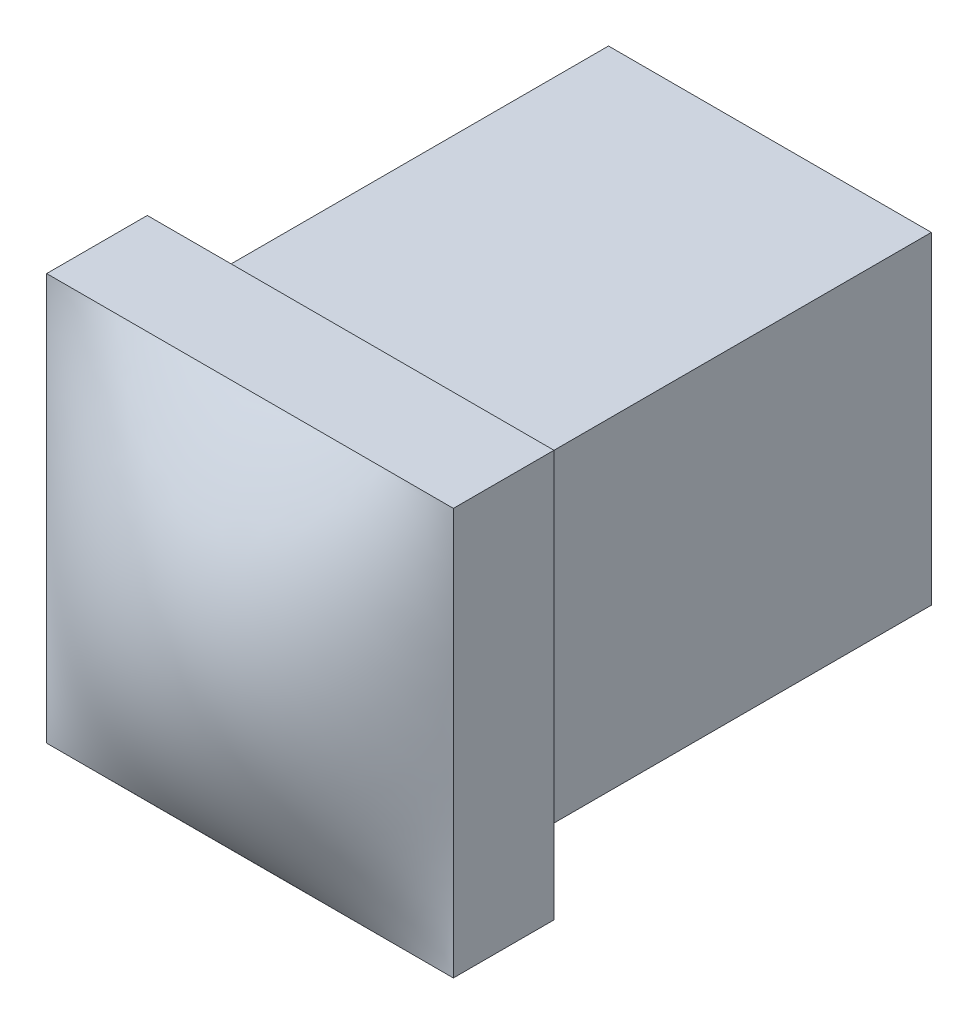
ISO-10303-21;
HEADER;
FILE_DESCRIPTION(('STEP AP214'),'2;1');
FILE_NAME('part.step','',(''),(''),'','','');
FILE_SCHEMA(('AUTOMOTIVE_DESIGN { 1 0 10303 214 1 1 1 1 }'));
ENDSEC;
DATA;
#1=APPLICATION_CONTEXT('core data for automotive mechanical design processes');
#2=APPLICATION_PROTOCOL_DEFINITION('international standard','automotive_design',2000,#1);
#3=PRODUCT_CONTEXT('',#1,'mechanical');
#4=PRODUCT('Part','Part','',(#3));
#5=PRODUCT_RELATED_PRODUCT_CATEGORY('part','',(#4));
#6=PRODUCT_DEFINITION_FORMATION('','',#4);
#7=PRODUCT_DEFINITION_CONTEXT('part definition',#1,'design');
#8=PRODUCT_DEFINITION('design','',#6,#7);
#9=PRODUCT_DEFINITION_SHAPE('','',#8);
#10=(LENGTH_UNIT() NAMED_UNIT(*) SI_UNIT(.MILLI.,.METRE.));
#11=(NAMED_UNIT(*) PLANE_ANGLE_UNIT() SI_UNIT($,.RADIAN.));
#12=(NAMED_UNIT(*) SI_UNIT($,.STERADIAN.) SOLID_ANGLE_UNIT());
#13=UNCERTAINTY_MEASURE_WITH_UNIT(LENGTH_MEASURE(1.E-05),#10,'distance_accuracy_value','');
#14=(GEOMETRIC_REPRESENTATION_CONTEXT(3) GLOBAL_UNCERTAINTY_ASSIGNED_CONTEXT((#13)) GLOBAL_UNIT_ASSIGNED_CONTEXT((#10,
#11,#12)) REPRESENTATION_CONTEXT('',''));
#15=CARTESIAN_POINT('',(0.,0.,0.));
#16=DIRECTION('',(0.,0.,1.));
#17=DIRECTION('',(1.,0.,0.));
#18=AXIS2_PLACEMENT_3D('',#15,#16,#17);
#19=CARTESIAN_POINT('',(0.,0.,0.));
#20=DIRECTION('',(0.,0.,-1.));
#21=DIRECTION('',(-1.,0.,0.));
#22=AXIS2_PLACEMENT_3D('',#19,#20,#21);
#23=PLANE('',#22);
#24=DIRECTION('',(0.,-1.,0.));
#25=VECTOR('',#24,1.);
#26=CARTESIAN_POINT('',(0.,0.,0.));
#27=LINE('',#26,#25);
#28=CARTESIAN_POINT('',(0.,4.85,0.));
#29=VERTEX_POINT('',#28);
#30=CARTESIAN_POINT('',(0.,0.,0.));
#31=VERTEX_POINT('',#30);
#32=EDGE_CURVE('E139',#29,#31,#27,.T.);
#33=ORIENTED_EDGE('',*,*,#32,.F.);
#34=DIRECTION('',(-1.,0.,0.));
#35=VECTOR('',#34,1.);
#36=CARTESIAN_POINT('',(0.,4.85,0.));
#37=LINE('',#36,#35);
#38=CARTESIAN_POINT('',(4.85,4.85,0.));
#39=VERTEX_POINT('',#38);
#40=EDGE_CURVE('E78',#39,#29,#37,.T.);
#41=ORIENTED_EDGE('',*,*,#40,.F.);
#42=DIRECTION('',(0.,1.,0.));
#43=VECTOR('',#42,1.);
#44=CARTESIAN_POINT('',(4.85,0.,0.));
#45=LINE('',#44,#43);
#46=CARTESIAN_POINT('',(4.85,0.,0.));
#47=VERTEX_POINT('',#46);
#48=EDGE_CURVE('E86',#47,#39,#45,.T.);
#49=ORIENTED_EDGE('',*,*,#48,.F.);
#50=DIRECTION('',(1.,0.,0.));
#51=VECTOR('',#50,1.);
#52=CARTESIAN_POINT('',(0.,0.,0.));
#53=LINE('',#52,#51);
#54=EDGE_CURVE('E142',#31,#47,#53,.T.);
#55=ORIENTED_EDGE('',*,*,#54,.F.);
#56=EDGE_LOOP('',(#33,#41,#49,#55));
#57=FACE_BOUND('',#56,.T.);
#58=DIRECTION('',(1.,0.,0.));
#59=VECTOR('',#58,1.);
#60=CARTESIAN_POINT('',(4.35,4.35,0.));
#61=LINE('',#60,#59);
#62=CARTESIAN_POINT('',(0.499999999999999,4.35,0.));
#63=VERTEX_POINT('',#62);
#64=CARTESIAN_POINT('',(4.35,4.35,0.));
#65=VERTEX_POINT('',#64);
#66=EDGE_CURVE('E172',#63,#65,#61,.T.);
#67=ORIENTED_EDGE('',*,*,#66,.F.);
#68=DIRECTION('',(0.,1.,0.));
#69=VECTOR('',#68,1.);
#70=CARTESIAN_POINT('',(0.499999999999999,4.35,0.));
#71=LINE('',#70,#69);
#72=CARTESIAN_POINT('',(0.499999999999998,0.499999999999999,0.));
#73=VERTEX_POINT('',#72);
#74=EDGE_CURVE('E137',#73,#63,#71,.T.);
#75=ORIENTED_EDGE('',*,*,#74,.F.);
#76=DIRECTION('',(-1.,0.,0.));
#77=VECTOR('',#76,1.);
#78=CARTESIAN_POINT('',(4.35,0.499999999999999,0.));
#79=LINE('',#78,#77);
#80=CARTESIAN_POINT('',(4.35,0.499999999999999,0.));
#81=VERTEX_POINT('',#80);
#82=EDGE_CURVE('E133',#81,#73,#79,.T.);
#83=ORIENTED_EDGE('',*,*,#82,.F.);
#84=DIRECTION('',(0.,-1.,0.));
#85=VECTOR('',#84,1.);
#86=CARTESIAN_POINT('',(4.35,4.35,0.));
#87=LINE('',#86,#85);
#88=EDGE_CURVE('E174',#65,#81,#87,.T.);
#89=ORIENTED_EDGE('',*,*,#88,.F.);
#90=EDGE_LOOP('',(#67,#75,#83,#89));
#91=FACE_BOUND('',#90,.T.);
#92=ADVANCED_FACE('F32',(#57,#91),#23,.T.);
#93=CARTESIAN_POINT('',(0.,0.,1.2));
#94=DIRECTION('',(1.,0.,0.));
#95=DIRECTION('',(0.,0.,-1.));
#96=AXIS2_PLACEMENT_3D('',#93,#94,#95);
#97=PLANE('',#96);
#98=ORIENTED_EDGE('',*,*,#32,.T.);
#99=DIRECTION('',(0.,0.,-1.));
#100=VECTOR('',#99,1.);
#101=CARTESIAN_POINT('',(0.,0.,1.2));
#102=LINE('',#101,#100);
#103=CARTESIAN_POINT('',(0.,0.,1.2));
#104=VERTEX_POINT('',#103);
#105=EDGE_CURVE('E11',#104,#31,#102,.T.);
#106=ORIENTED_EDGE('',*,*,#105,.F.);
#107=DIRECTION('',(0.,-1.,0.));
#108=VECTOR('',#107,1.);
#109=CARTESIAN_POINT('',(0.,0.,1.2));
#110=LINE('',#109,#108);
#111=CARTESIAN_POINT('',(0.,4.85,1.2));
#112=VERTEX_POINT('',#111);
#113=EDGE_CURVE('E150',#112,#104,#110,.T.);
#114=ORIENTED_EDGE('',*,*,#113,.F.);
#115=DIRECTION('',(0.,0.,-1.));
#116=VECTOR('',#115,1.);
#117=CARTESIAN_POINT('',(0.,4.85,1.2));
#118=LINE('',#117,#116);
#119=EDGE_CURVE('E151',#112,#29,#118,.T.);
#120=ORIENTED_EDGE('',*,*,#119,.T.);
#121=EDGE_LOOP('',(#98,#106,#114,#120));
#122=FACE_BOUND('',#121,.T.);
#123=ADVANCED_FACE('F166',(#122),#97,.F.);
#124=CARTESIAN_POINT('',(0.,0.,1.2));
#125=DIRECTION('',(0.,1.,0.));
#126=DIRECTION('',(0.,0.,1.));
#127=AXIS2_PLACEMENT_3D('',#124,#125,#126);
#128=PLANE('',#127);
#129=ORIENTED_EDGE('',*,*,#54,.T.);
#130=DIRECTION('',(0.,0.,-1.));
#131=VECTOR('',#130,1.);
#132=CARTESIAN_POINT('',(4.85,0.,1.2));
#133=LINE('',#132,#131);
#134=CARTESIAN_POINT('',(4.85,0.,1.2));
#135=VERTEX_POINT('',#134);
#136=EDGE_CURVE('E43',#135,#47,#133,.T.);
#137=ORIENTED_EDGE('',*,*,#136,.F.);
#138=DIRECTION('',(1.,0.,0.));
#139=VECTOR('',#138,1.);
#140=CARTESIAN_POINT('',(0.,0.,1.2));
#141=LINE('',#140,#139);
#142=EDGE_CURVE('E38',#104,#135,#141,.T.);
#143=ORIENTED_EDGE('',*,*,#142,.F.);
#144=ORIENTED_EDGE('',*,*,#105,.T.);
#145=EDGE_LOOP('',(#129,#137,#143,#144));
#146=FACE_BOUND('',#145,.T.);
#147=ADVANCED_FACE('F161',(#146),#128,.F.);
#148=CARTESIAN_POINT('',(4.85,0.,1.2));
#149=DIRECTION('',(-1.,0.,0.));
#150=DIRECTION('',(0.,0.,1.));
#151=AXIS2_PLACEMENT_3D('',#148,#149,#150);
#152=PLANE('',#151);
#153=ORIENTED_EDGE('',*,*,#48,.T.);
#154=DIRECTION('',(0.,0.,-1.));
#155=VECTOR('',#154,1.);
#156=CARTESIAN_POINT('',(4.85,4.85,1.2));
#157=LINE('',#156,#155);
#158=CARTESIAN_POINT('',(4.85,4.85,1.2));
#159=VERTEX_POINT('',#158);
#160=EDGE_CURVE('E153',#159,#39,#157,.T.);
#161=ORIENTED_EDGE('',*,*,#160,.F.);
#162=DIRECTION('',(0.,1.,0.));
#163=VECTOR('',#162,1.);
#164=CARTESIAN_POINT('',(4.85,0.,1.2));
#165=LINE('',#164,#163);
#166=EDGE_CURVE('E157',#135,#159,#165,.T.);
#167=ORIENTED_EDGE('',*,*,#166,.F.);
#168=ORIENTED_EDGE('',*,*,#136,.T.);
#169=EDGE_LOOP('',(#153,#161,#167,#168));
#170=FACE_BOUND('',#169,.T.);
#171=ADVANCED_FACE('F162',(#170),#152,.F.);
#172=CARTESIAN_POINT('',(0.,4.85,1.2));
#173=DIRECTION('',(0.,-1.,0.));
#174=DIRECTION('',(0.,0.,-1.));
#175=AXIS2_PLACEMENT_3D('',#172,#173,#174);
#176=PLANE('',#175);
#177=ORIENTED_EDGE('',*,*,#40,.T.);
#178=ORIENTED_EDGE('',*,*,#119,.F.);
#179=DIRECTION('',(-1.,0.,0.));
#180=VECTOR('',#179,1.);
#181=CARTESIAN_POINT('',(0.,4.85,1.2));
#182=LINE('',#181,#180);
#183=EDGE_CURVE('E60',#159,#112,#182,.T.);
#184=ORIENTED_EDGE('',*,*,#183,.F.);
#185=ORIENTED_EDGE('',*,*,#160,.T.);
#186=EDGE_LOOP('',(#177,#178,#184,#185));
#187=FACE_BOUND('',#186,.T.);
#188=ADVANCED_FACE('F163',(#187),#176,.F.);
#189=CARTESIAN_POINT('',(0.,0.,1.2));
#190=CARTESIAN_POINT('',(1.61666666666667,0.,1.2));
#191=CARTESIAN_POINT('',(3.23333333333333,0.,1.2));
#192=CARTESIAN_POINT('',(4.85,0.,1.2));
#193=CARTESIAN_POINT('',(0.,1.61666666666667,1.2));
#194=CARTESIAN_POINT('',(1.61666666666667,1.61666666666667,2.97777777777778));
#195=CARTESIAN_POINT('',(3.23333333333333,1.61666666666667,2.97777777777778));
#196=CARTESIAN_POINT('',(4.85,1.61666666666667,1.2));
#197=CARTESIAN_POINT('',(0.,3.23333333333333,1.2));
#198=CARTESIAN_POINT('',(1.61666666666667,3.23333333333333,2.97777777777778));
#199=CARTESIAN_POINT('',(3.23333333333333,3.23333333333333,2.97777777777778));
#200=CARTESIAN_POINT('',(4.85,3.23333333333333,1.2));
#201=CARTESIAN_POINT('',(0.,4.85,1.2));
#202=CARTESIAN_POINT('',(1.61666666666667,4.85,1.2));
#203=CARTESIAN_POINT('',(3.23333333333333,4.85,1.2));
#204=CARTESIAN_POINT('',(4.85,4.85,1.2));
#205=B_SPLINE_SURFACE_WITH_KNOTS('',3,3,((#189,#190,#191,#192),(#193,#194,#195,#196),(#197,#198,
#199,#200),(#201,#202,#203,#204)),.UNSPECIFIED.,.F.,.F.,.F.,(4,4),(4,4),(0.,1.),(0.,1.),.UNSPECIFIED.);
#206=ORIENTED_EDGE('',*,*,#113,.T.);
#207=ORIENTED_EDGE('',*,*,#142,.T.);
#208=ORIENTED_EDGE('',*,*,#166,.T.);
#209=ORIENTED_EDGE('',*,*,#183,.T.);
#210=EDGE_LOOP('',(#206,#207,#208,#209));
#211=FACE_BOUND('',#210,.T.);
#212=ADVANCED_FACE('F34',(#211),#205,.F.);
#213=CARTESIAN_POINT('',(0.499999999999999,4.35,-5.));
#214=DIRECTION('',(1.,0.,0.));
#215=DIRECTION('',(0.,1.,0.));
#216=AXIS2_PLACEMENT_3D('',#213,#214,#215);
#217=PLANE('',#216);
#218=ORIENTED_EDGE('',*,*,#74,.T.);
#219=DIRECTION('',(0.,0.,1.));
#220=VECTOR('',#219,1.);
#221=CARTESIAN_POINT('',(0.499999999999999,4.35,-5.));
#222=LINE('',#221,#220);
#223=CARTESIAN_POINT('',(0.499999999999999,4.35,-5.));
#224=VERTEX_POINT('',#223);
#225=EDGE_CURVE('E118',#224,#63,#222,.T.);
#226=ORIENTED_EDGE('',*,*,#225,.F.);
#227=DIRECTION('',(0.,1.,0.));
#228=VECTOR('',#227,1.);
#229=CARTESIAN_POINT('',(0.499999999999999,4.35,-5.));
#230=LINE('',#229,#228);
#231=CARTESIAN_POINT('',(0.499999999999998,0.499999999999999,-5.));
#232=VERTEX_POINT('',#231);
#233=EDGE_CURVE('E125',#232,#224,#230,.T.);
#234=ORIENTED_EDGE('',*,*,#233,.F.);
#235=DIRECTION('',(0.,0.,1.));
#236=VECTOR('',#235,1.);
#237=CARTESIAN_POINT('',(0.499999999999998,0.499999999999999,-5.));
#238=LINE('',#237,#236);
#239=EDGE_CURVE('E181',#232,#73,#238,.T.);
#240=ORIENTED_EDGE('',*,*,#239,.T.);
#241=EDGE_LOOP('',(#218,#226,#234,#240));
#242=FACE_BOUND('',#241,.T.);
#243=ADVANCED_FACE('F135',(#242),#217,.F.);
#244=CARTESIAN_POINT('',(4.35,4.35,-5.));
#245=DIRECTION('',(0.,-1.,0.));
#246=DIRECTION('',(0.,0.,-1.));
#247=AXIS2_PLACEMENT_3D('',#244,#245,#246);
#248=PLANE('',#247);
#249=ORIENTED_EDGE('',*,*,#66,.T.);
#250=DIRECTION('',(0.,0.,1.));
#251=VECTOR('',#250,1.);
#252=CARTESIAN_POINT('',(4.35,4.35,-5.));
#253=LINE('',#252,#251);
#254=CARTESIAN_POINT('',(4.35,4.35,-5.));
#255=VERTEX_POINT('',#254);
#256=EDGE_CURVE('E121',#255,#65,#253,.T.);
#257=ORIENTED_EDGE('',*,*,#256,.F.);
#258=DIRECTION('',(1.,0.,0.));
#259=VECTOR('',#258,1.);
#260=CARTESIAN_POINT('',(4.35,4.35,-5.));
#261=LINE('',#260,#259);
#262=EDGE_CURVE('E114',#224,#255,#261,.T.);
#263=ORIENTED_EDGE('',*,*,#262,.F.);
#264=ORIENTED_EDGE('',*,*,#225,.T.);
#265=EDGE_LOOP('',(#249,#257,#263,#264));
#266=FACE_BOUND('',#265,.T.);
#267=ADVANCED_FACE('F116',(#266),#248,.F.);
#268=CARTESIAN_POINT('',(4.35,4.35,-5.));
#269=DIRECTION('',(-1.,0.,0.));
#270=DIRECTION('',(0.,-1.,0.));
#271=AXIS2_PLACEMENT_3D('',#268,#269,#270);
#272=PLANE('',#271);
#273=ORIENTED_EDGE('',*,*,#88,.T.);
#274=DIRECTION('',(0.,0.,1.));
#275=VECTOR('',#274,1.);
#276=CARTESIAN_POINT('',(4.35,0.499999999999999,-5.));
#277=LINE('',#276,#275);
#278=CARTESIAN_POINT('',(4.35,0.499999999999999,-5.));
#279=VERTEX_POINT('',#278);
#280=EDGE_CURVE('E51',#279,#81,#277,.T.);
#281=ORIENTED_EDGE('',*,*,#280,.F.);
#282=DIRECTION('',(0.,-1.,0.));
#283=VECTOR('',#282,1.);
#284=CARTESIAN_POINT('',(4.35,4.35,-5.));
#285=LINE('',#284,#283);
#286=EDGE_CURVE('E124',#255,#279,#285,.T.);
#287=ORIENTED_EDGE('',*,*,#286,.F.);
#288=ORIENTED_EDGE('',*,*,#256,.T.);
#289=EDGE_LOOP('',(#273,#281,#287,#288));
#290=FACE_BOUND('',#289,.T.);
#291=ADVANCED_FACE('F184',(#290),#272,.F.);
#292=CARTESIAN_POINT('',(4.35,0.499999999999999,-5.));
#293=DIRECTION('',(0.,1.,0.));
#294=DIRECTION('',(0.,0.,1.));
#295=AXIS2_PLACEMENT_3D('',#292,#293,#294);
#296=PLANE('',#295);
#297=ORIENTED_EDGE('',*,*,#82,.T.);
#298=ORIENTED_EDGE('',*,*,#239,.F.);
#299=DIRECTION('',(-1.,0.,0.));
#300=VECTOR('',#299,1.);
#301=CARTESIAN_POINT('',(4.35,0.499999999999999,-5.));
#302=LINE('',#301,#300);
#303=EDGE_CURVE('E129',#279,#232,#302,.T.);
#304=ORIENTED_EDGE('',*,*,#303,.F.);
#305=ORIENTED_EDGE('',*,*,#280,.T.);
#306=EDGE_LOOP('',(#297,#298,#304,#305));
#307=FACE_BOUND('',#306,.T.);
#308=ADVANCED_FACE('F185',(#307),#296,.F.);
#309=CARTESIAN_POINT('',(0.,0.,-5.));
#310=DIRECTION('',(0.,0.,-1.));
#311=DIRECTION('',(-1.,0.,0.));
#312=AXIS2_PLACEMENT_3D('',#309,#310,#311);
#313=PLANE('',#312);
#314=ORIENTED_EDGE('',*,*,#233,.T.);
#315=ORIENTED_EDGE('',*,*,#262,.T.);
#316=ORIENTED_EDGE('',*,*,#286,.T.);
#317=ORIENTED_EDGE('',*,*,#303,.T.);
#318=EDGE_LOOP('',(#314,#315,#316,#317));
#319=FACE_BOUND('',#318,.T.);
#320=ADVANCED_FACE('F128',(#319),#313,.T.);
#321=CLOSED_SHELL('',(#92,#123,#147,#171,#188,#212,#243,#267,#291,#308,#320));
#322=MANIFOLD_SOLID_BREP('B2',#321);
#323=ADVANCED_BREP_SHAPE_REPRESENTATION('',(#18,#322),#14);
#324=SHAPE_DEFINITION_REPRESENTATION(#9,#323);
ENDSEC;
END-ISO-10303-21;
